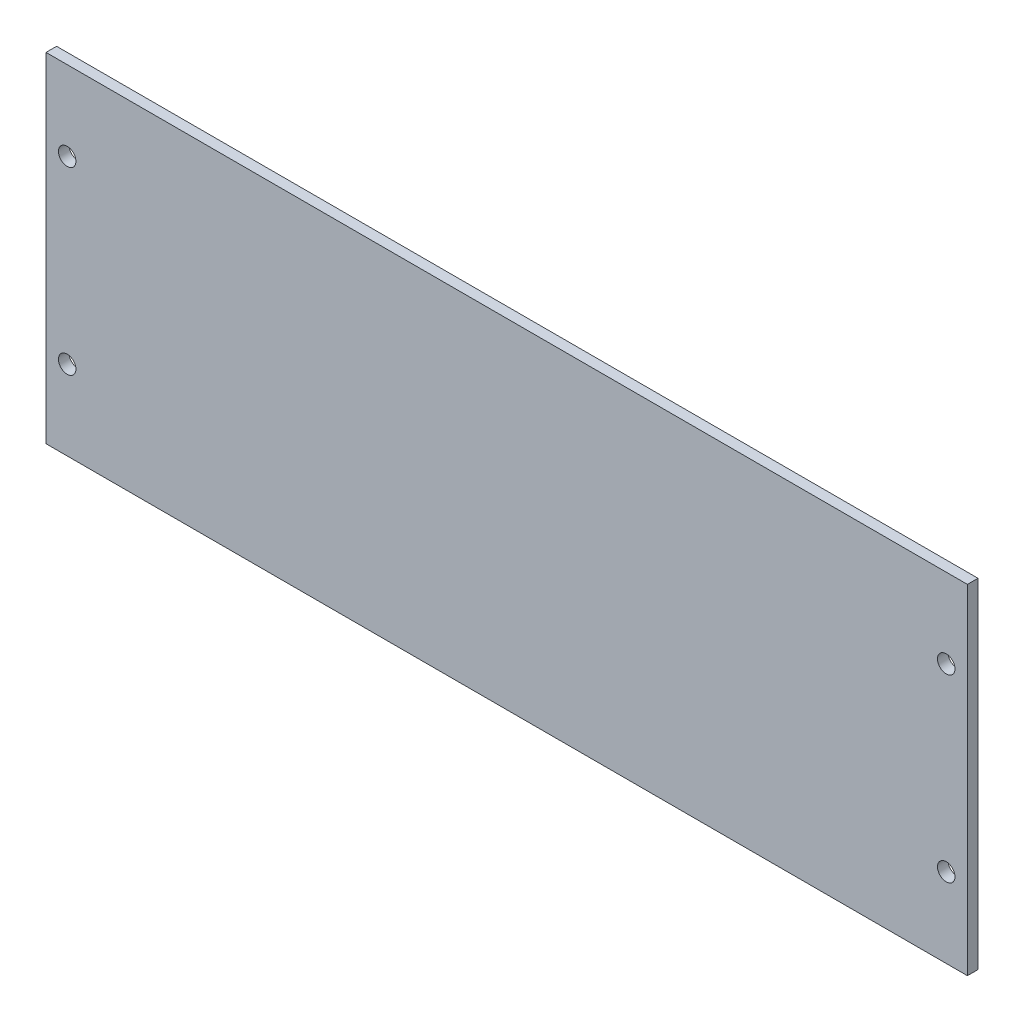
ISO-10303-21;
HEADER;
FILE_DESCRIPTION(('STEP AP214'),'2;1');
FILE_NAME('part.step','',(''),(''),'','','');
FILE_SCHEMA(('AUTOMOTIVE_DESIGN { 1 0 10303 214 1 1 1 1 }'));
ENDSEC;
DATA;
#1=APPLICATION_CONTEXT('core data for automotive mechanical design processes');
#2=APPLICATION_PROTOCOL_DEFINITION('international standard','automotive_design',2000,#1);
#3=PRODUCT_CONTEXT('',#1,'mechanical');
#4=PRODUCT('Part','Part','',(#3));
#5=PRODUCT_RELATED_PRODUCT_CATEGORY('part','',(#4));
#6=PRODUCT_DEFINITION_FORMATION('','',#4);
#7=PRODUCT_DEFINITION_CONTEXT('part definition',#1,'design');
#8=PRODUCT_DEFINITION('design','',#6,#7);
#9=PRODUCT_DEFINITION_SHAPE('','',#8);
#10=(LENGTH_UNIT() NAMED_UNIT(*) SI_UNIT(.MILLI.,.METRE.));
#11=(NAMED_UNIT(*) PLANE_ANGLE_UNIT() SI_UNIT($,.RADIAN.));
#12=(NAMED_UNIT(*) SI_UNIT($,.STERADIAN.) SOLID_ANGLE_UNIT());
#13=UNCERTAINTY_MEASURE_WITH_UNIT(LENGTH_MEASURE(1.E-05),#10,'distance_accuracy_value','');
#14=(GEOMETRIC_REPRESENTATION_CONTEXT(3) GLOBAL_UNCERTAINTY_ASSIGNED_CONTEXT((#13)) GLOBAL_UNIT_ASSIGNED_CONTEXT((#10,
#11,#12)) REPRESENTATION_CONTEXT('',''));
#15=CARTESIAN_POINT('',(0.,0.,0.));
#16=DIRECTION('',(0.,0.,1.));
#17=DIRECTION('',(1.,0.,0.));
#18=AXIS2_PLACEMENT_3D('',#15,#16,#17);
#19=CARTESIAN_POINT('',(174.,-64.,4.));
#20=DIRECTION('',(-1.,0.,0.));
#21=DIRECTION('',(0.,0.,1.));
#22=AXIS2_PLACEMENT_3D('',#19,#20,#21);
#23=PLANE('',#22);
#24=DIRECTION('',(0.,1.,0.));
#25=VECTOR('',#24,1.);
#26=CARTESIAN_POINT('',(174.,-64.,0.));
#27=LINE('',#26,#25);
#28=CARTESIAN_POINT('',(174.,-64.,0.));
#29=VERTEX_POINT('',#28);
#30=CARTESIAN_POINT('',(174.,64.,0.));
#31=VERTEX_POINT('',#30);
#32=EDGE_CURVE('E96',#29,#31,#27,.T.);
#33=ORIENTED_EDGE('',*,*,#32,.T.);
#34=DIRECTION('',(0.,0.,-1.));
#35=VECTOR('',#34,1.);
#36=CARTESIAN_POINT('',(174.,64.,4.));
#37=LINE('',#36,#35);
#38=CARTESIAN_POINT('',(174.,64.,4.));
#39=VERTEX_POINT('',#38);
#40=EDGE_CURVE('E11',#39,#31,#37,.T.);
#41=ORIENTED_EDGE('',*,*,#40,.F.);
#42=DIRECTION('',(0.,1.,0.));
#43=VECTOR('',#42,1.);
#44=CARTESIAN_POINT('',(174.,-64.,4.));
#45=LINE('',#44,#43);
#46=CARTESIAN_POINT('',(174.,-64.,4.));
#47=VERTEX_POINT('',#46);
#48=EDGE_CURVE('E84',#47,#39,#45,.T.);
#49=ORIENTED_EDGE('',*,*,#48,.F.);
#50=DIRECTION('',(0.,0.,-1.));
#51=VECTOR('',#50,1.);
#52=CARTESIAN_POINT('',(174.,-64.,4.));
#53=LINE('',#52,#51);
#54=EDGE_CURVE('E92',#47,#29,#53,.T.);
#55=ORIENTED_EDGE('',*,*,#54,.T.);
#56=EDGE_LOOP('',(#33,#41,#49,#55));
#57=FACE_BOUND('',#56,.T.);
#58=ADVANCED_FACE('F33',(#57),#23,.F.);
#59=CARTESIAN_POINT('',(-174.,64.,4.));
#60=DIRECTION('',(0.,-1.,0.));
#61=DIRECTION('',(0.,0.,-1.));
#62=AXIS2_PLACEMENT_3D('',#59,#60,#61);
#63=PLANE('',#62);
#64=DIRECTION('',(-1.,0.,0.));
#65=VECTOR('',#64,1.);
#66=CARTESIAN_POINT('',(-174.,64.,0.));
#67=LINE('',#66,#65);
#68=CARTESIAN_POINT('',(-174.,64.,0.));
#69=VERTEX_POINT('',#68);
#70=EDGE_CURVE('E88',#31,#69,#67,.T.);
#71=ORIENTED_EDGE('',*,*,#70,.T.);
#72=DIRECTION('',(0.,0.,-1.));
#73=VECTOR('',#72,1.);
#74=CARTESIAN_POINT('',(-174.,64.,4.));
#75=LINE('',#74,#73);
#76=CARTESIAN_POINT('',(-174.,64.,4.));
#77=VERTEX_POINT('',#76);
#78=EDGE_CURVE('E41',#77,#69,#75,.T.);
#79=ORIENTED_EDGE('',*,*,#78,.F.);
#80=DIRECTION('',(-1.,0.,0.));
#81=VECTOR('',#80,1.);
#82=CARTESIAN_POINT('',(-174.,64.,4.));
#83=LINE('',#82,#81);
#84=EDGE_CURVE('E79',#39,#77,#83,.T.);
#85=ORIENTED_EDGE('',*,*,#84,.F.);
#86=ORIENTED_EDGE('',*,*,#40,.T.);
#87=EDGE_LOOP('',(#71,#79,#85,#86));
#88=FACE_BOUND('',#87,.T.);
#89=ADVANCED_FACE('F87',(#88),#63,.F.);
#90=CARTESIAN_POINT('',(-174.,-64.,4.));
#91=DIRECTION('',(1.,0.,0.));
#92=DIRECTION('',(0.,0.,-1.));
#93=AXIS2_PLACEMENT_3D('',#90,#91,#92);
#94=PLANE('',#93);
#95=DIRECTION('',(0.,-1.,0.));
#96=VECTOR('',#95,1.);
#97=CARTESIAN_POINT('',(-174.,-64.,0.));
#98=LINE('',#97,#96);
#99=CARTESIAN_POINT('',(-174.,-64.,0.));
#100=VERTEX_POINT('',#99);
#101=EDGE_CURVE('E66',#69,#100,#98,.T.);
#102=ORIENTED_EDGE('',*,*,#101,.T.);
#103=DIRECTION('',(0.,0.,-1.));
#104=VECTOR('',#103,1.);
#105=CARTESIAN_POINT('',(-174.,-64.,4.));
#106=LINE('',#105,#104);
#107=CARTESIAN_POINT('',(-174.,-64.,4.));
#108=VERTEX_POINT('',#107);
#109=EDGE_CURVE('E89',#108,#100,#106,.T.);
#110=ORIENTED_EDGE('',*,*,#109,.F.);
#111=DIRECTION('',(0.,-1.,0.));
#112=VECTOR('',#111,1.);
#113=CARTESIAN_POINT('',(-174.,-64.,4.));
#114=LINE('',#113,#112);
#115=EDGE_CURVE('E82',#77,#108,#114,.T.);
#116=ORIENTED_EDGE('',*,*,#115,.F.);
#117=ORIENTED_EDGE('',*,*,#78,.T.);
#118=EDGE_LOOP('',(#102,#110,#116,#117));
#119=FACE_BOUND('',#118,.T.);
#120=ADVANCED_FACE('F90',(#119),#94,.F.);
#121=CARTESIAN_POINT('',(-174.,-64.,4.));
#122=DIRECTION('',(0.,1.,0.));
#123=DIRECTION('',(0.,0.,1.));
#124=AXIS2_PLACEMENT_3D('',#121,#122,#123);
#125=PLANE('',#124);
#126=DIRECTION('',(1.,0.,0.));
#127=VECTOR('',#126,1.);
#128=CARTESIAN_POINT('',(-174.,-64.,0.));
#129=LINE('',#128,#127);
#130=EDGE_CURVE('E72',#100,#29,#129,.T.);
#131=ORIENTED_EDGE('',*,*,#130,.T.);
#132=ORIENTED_EDGE('',*,*,#54,.F.);
#133=DIRECTION('',(1.,0.,0.));
#134=VECTOR('',#133,1.);
#135=CARTESIAN_POINT('',(-174.,-64.,4.));
#136=LINE('',#135,#134);
#137=EDGE_CURVE('E49',#108,#47,#136,.T.);
#138=ORIENTED_EDGE('',*,*,#137,.F.);
#139=ORIENTED_EDGE('',*,*,#109,.T.);
#140=EDGE_LOOP('',(#131,#132,#138,#139));
#141=FACE_BOUND('',#140,.T.);
#142=ADVANCED_FACE('F104',(#141),#125,.F.);
#143=CARTESIAN_POINT('',(0.,0.,4.));
#144=DIRECTION('',(0.,0.,-1.));
#145=DIRECTION('',(-1.,0.,0.));
#146=AXIS2_PLACEMENT_3D('',#143,#144,#145);
#147=PLANE('',#146);
#148=CARTESIAN_POINT('',(-166.,34.0000000000001,4.));
#149=DIRECTION('',(0.,0.,-1.));
#150=DIRECTION('',(-1.,0.,0.));
#151=AXIS2_PLACEMENT_3D('',#148,#149,#150);
#152=CIRCLE('',#151,3.3);
#153=CARTESIAN_POINT('',(-169.3,34.0000000000001,4.));
#154=VERTEX_POINT('',#153);
#155=EDGE_CURVE('E127',#154,#154,#152,.T.);
#156=ORIENTED_EDGE('',*,*,#155,.T.);
#157=EDGE_LOOP('',(#156));
#158=FACE_BOUND('',#157,.T.);
#159=CARTESIAN_POINT('',(166.,34.,4.));
#160=DIRECTION('',(0.,0.,-1.));
#161=DIRECTION('',(-1.,0.,0.));
#162=AXIS2_PLACEMENT_3D('',#159,#160,#161);
#163=CIRCLE('',#162,3.3);
#164=CARTESIAN_POINT('',(162.7,34.,4.));
#165=VERTEX_POINT('',#164);
#166=EDGE_CURVE('E121',#165,#165,#163,.T.);
#167=ORIENTED_EDGE('',*,*,#166,.T.);
#168=EDGE_LOOP('',(#167));
#169=FACE_BOUND('',#168,.T.);
#170=CARTESIAN_POINT('',(-166.,-34.0000000000001,4.));
#171=DIRECTION('',(0.,0.,-1.));
#172=DIRECTION('',(-1.,0.,0.));
#173=AXIS2_PLACEMENT_3D('',#170,#171,#172);
#174=CIRCLE('',#173,3.3);
#175=CARTESIAN_POINT('',(-169.3,-34.0000000000001,4.));
#176=VERTEX_POINT('',#175);
#177=EDGE_CURVE('E115',#176,#176,#174,.T.);
#178=ORIENTED_EDGE('',*,*,#177,.T.);
#179=EDGE_LOOP('',(#178));
#180=FACE_BOUND('',#179,.T.);
#181=CARTESIAN_POINT('',(166.,-34.0000000000001,4.));
#182=DIRECTION('',(0.,0.,-1.));
#183=DIRECTION('',(-1.,0.,0.));
#184=AXIS2_PLACEMENT_3D('',#181,#182,#183);
#185=CIRCLE('',#184,3.3);
#186=CARTESIAN_POINT('',(162.7,-34.0000000000001,4.));
#187=VERTEX_POINT('',#186);
#188=EDGE_CURVE('E99',#187,#187,#185,.T.);
#189=ORIENTED_EDGE('',*,*,#188,.T.);
#190=EDGE_LOOP('',(#189));
#191=FACE_BOUND('',#190,.T.);
#192=ORIENTED_EDGE('',*,*,#48,.T.);
#193=ORIENTED_EDGE('',*,*,#84,.T.);
#194=ORIENTED_EDGE('',*,*,#115,.T.);
#195=ORIENTED_EDGE('',*,*,#137,.T.);
#196=EDGE_LOOP('',(#192,#193,#194,#195));
#197=FACE_BOUND('',#196,.T.);
#198=ADVANCED_FACE('F80',(#158,#169,#180,#191,#197),#147,.F.);
#199=CARTESIAN_POINT('',(0.,0.,0.));
#200=DIRECTION('',(0.,0.,-1.));
#201=DIRECTION('',(-1.,0.,0.));
#202=AXIS2_PLACEMENT_3D('',#199,#200,#201);
#203=PLANE('',#202);
#204=CARTESIAN_POINT('',(-166.,34.0000000000001,0.));
#205=DIRECTION('',(0.,0.,-1.));
#206=DIRECTION('',(-1.,0.,0.));
#207=AXIS2_PLACEMENT_3D('',#204,#205,#206);
#208=CIRCLE('',#207,3.3);
#209=CARTESIAN_POINT('',(-169.3,34.0000000000001,0.));
#210=VERTEX_POINT('',#209);
#211=EDGE_CURVE('E130',#210,#210,#208,.T.);
#212=ORIENTED_EDGE('',*,*,#211,.F.);
#213=EDGE_LOOP('',(#212));
#214=FACE_BOUND('',#213,.T.);
#215=CARTESIAN_POINT('',(166.,34.,0.));
#216=DIRECTION('',(0.,0.,-1.));
#217=DIRECTION('',(-1.,0.,0.));
#218=AXIS2_PLACEMENT_3D('',#215,#216,#217);
#219=CIRCLE('',#218,3.3);
#220=CARTESIAN_POINT('',(162.7,34.,0.));
#221=VERTEX_POINT('',#220);
#222=EDGE_CURVE('E124',#221,#221,#219,.T.);
#223=ORIENTED_EDGE('',*,*,#222,.F.);
#224=EDGE_LOOP('',(#223));
#225=FACE_BOUND('',#224,.T.);
#226=CARTESIAN_POINT('',(-166.,-34.0000000000001,0.));
#227=DIRECTION('',(0.,0.,-1.));
#228=DIRECTION('',(-1.,0.,0.));
#229=AXIS2_PLACEMENT_3D('',#226,#227,#228);
#230=CIRCLE('',#229,3.3);
#231=CARTESIAN_POINT('',(-169.3,-34.0000000000001,0.));
#232=VERTEX_POINT('',#231);
#233=EDGE_CURVE('E118',#232,#232,#230,.T.);
#234=ORIENTED_EDGE('',*,*,#233,.F.);
#235=EDGE_LOOP('',(#234));
#236=FACE_BOUND('',#235,.T.);
#237=CARTESIAN_POINT('',(166.,-34.0000000000001,0.));
#238=DIRECTION('',(0.,0.,-1.));
#239=DIRECTION('',(-1.,0.,0.));
#240=AXIS2_PLACEMENT_3D('',#237,#238,#239);
#241=CIRCLE('',#240,3.3);
#242=CARTESIAN_POINT('',(162.7,-34.0000000000001,0.));
#243=VERTEX_POINT('',#242);
#244=EDGE_CURVE('E112',#243,#243,#241,.T.);
#245=ORIENTED_EDGE('',*,*,#244,.F.);
#246=EDGE_LOOP('',(#245));
#247=FACE_BOUND('',#246,.T.);
#248=ORIENTED_EDGE('',*,*,#32,.F.);
#249=ORIENTED_EDGE('',*,*,#130,.F.);
#250=ORIENTED_EDGE('',*,*,#101,.F.);
#251=ORIENTED_EDGE('',*,*,#70,.F.);
#252=EDGE_LOOP('',(#248,#249,#250,#251));
#253=FACE_BOUND('',#252,.T.);
#254=ADVANCED_FACE('F107',(#214,#225,#236,#247,#253),#203,.T.);
#255=CARTESIAN_POINT('',(166.,-34.0000000000001,0.));
#256=DIRECTION('',(0.,0.,-1.));
#257=DIRECTION('',(-1.,0.,0.));
#258=AXIS2_PLACEMENT_3D('',#255,#256,#257);
#259=CYLINDRICAL_SURFACE('',#258,3.3);
#260=ORIENTED_EDGE('',*,*,#188,.F.);
#261=EDGE_LOOP('',(#260));
#262=FACE_BOUND('',#261,.T.);
#263=ORIENTED_EDGE('',*,*,#244,.T.);
#264=EDGE_LOOP('',(#263));
#265=FACE_BOUND('',#264,.T.);
#266=ADVANCED_FACE('F138',(#262,#265),#259,.F.);
#267=CARTESIAN_POINT('',(-166.,-34.0000000000001,0.));
#268=DIRECTION('',(0.,0.,-1.));
#269=DIRECTION('',(-1.,0.,0.));
#270=AXIS2_PLACEMENT_3D('',#267,#268,#269);
#271=CYLINDRICAL_SURFACE('',#270,3.3);
#272=ORIENTED_EDGE('',*,*,#177,.F.);
#273=EDGE_LOOP('',(#272));
#274=FACE_BOUND('',#273,.T.);
#275=ORIENTED_EDGE('',*,*,#233,.T.);
#276=EDGE_LOOP('',(#275));
#277=FACE_BOUND('',#276,.T.);
#278=ADVANCED_FACE('F147',(#274,#277),#271,.F.);
#279=CARTESIAN_POINT('',(166.,34.,0.));
#280=DIRECTION('',(0.,0.,-1.));
#281=DIRECTION('',(-1.,0.,0.));
#282=AXIS2_PLACEMENT_3D('',#279,#280,#281);
#283=CYLINDRICAL_SURFACE('',#282,3.3);
#284=ORIENTED_EDGE('',*,*,#166,.F.);
#285=EDGE_LOOP('',(#284));
#286=FACE_BOUND('',#285,.T.);
#287=ORIENTED_EDGE('',*,*,#222,.T.);
#288=EDGE_LOOP('',(#287));
#289=FACE_BOUND('',#288,.T.);
#290=ADVANCED_FACE('F153',(#286,#289),#283,.F.);
#291=CARTESIAN_POINT('',(-166.,34.0000000000001,0.));
#292=DIRECTION('',(0.,0.,-1.));
#293=DIRECTION('',(-1.,0.,0.));
#294=AXIS2_PLACEMENT_3D('',#291,#292,#293);
#295=CYLINDRICAL_SURFACE('',#294,3.3);
#296=ORIENTED_EDGE('',*,*,#155,.F.);
#297=EDGE_LOOP('',(#296));
#298=FACE_BOUND('',#297,.T.);
#299=ORIENTED_EDGE('',*,*,#211,.T.);
#300=EDGE_LOOP('',(#299));
#301=FACE_BOUND('',#300,.T.);
#302=ADVANCED_FACE('F134',(#298,#301),#295,.F.);
#303=CLOSED_SHELL('',(#58,#89,#120,#142,#198,#254,#266,#278,#290,#302));
#304=MANIFOLD_SOLID_BREP('B2',#303);
#305=ADVANCED_BREP_SHAPE_REPRESENTATION('',(#18,#304),#14);
#306=SHAPE_DEFINITION_REPRESENTATION(#9,#305);
ENDSEC;
END-ISO-10303-21;
